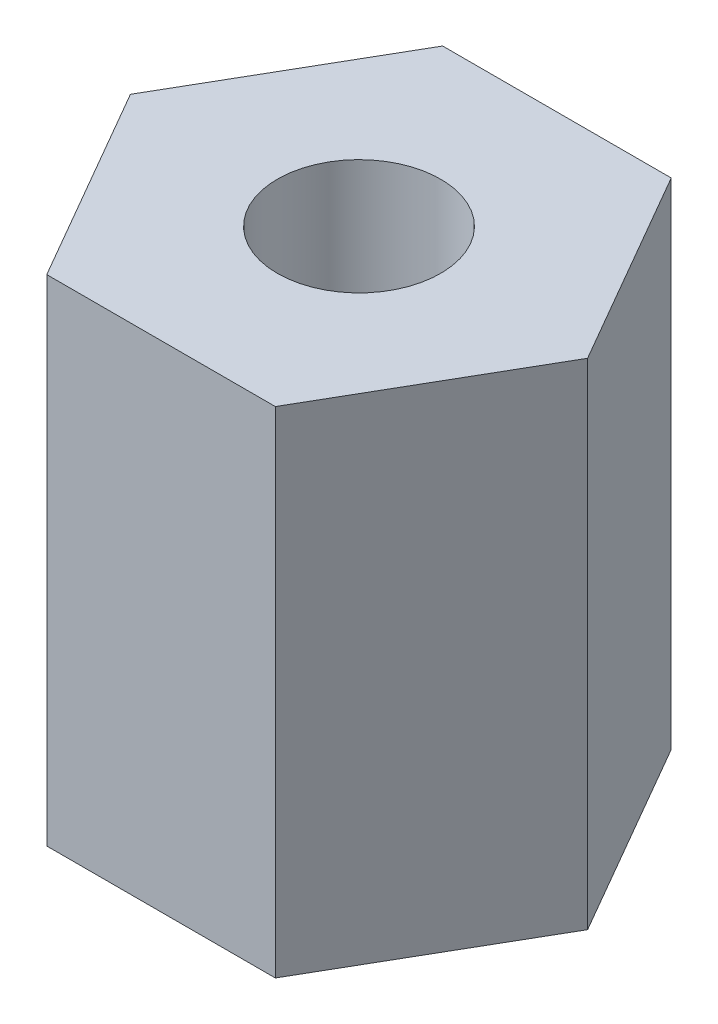
ISO-10303-21;
HEADER;
FILE_DESCRIPTION(('STEP AP214'),'2;1');
FILE_NAME('part.step','',(''),(''),'','','');
FILE_SCHEMA(('AUTOMOTIVE_DESIGN { 1 0 10303 214 1 1 1 1 }'));
ENDSEC;
DATA;
#1=APPLICATION_CONTEXT('core data for automotive mechanical design processes');
#2=APPLICATION_PROTOCOL_DEFINITION('international standard','automotive_design',2000,#1);
#3=PRODUCT_CONTEXT('',#1,'mechanical');
#4=PRODUCT('Part','Part','',(#3));
#5=PRODUCT_RELATED_PRODUCT_CATEGORY('part','',(#4));
#6=PRODUCT_DEFINITION_FORMATION('','',#4);
#7=PRODUCT_DEFINITION_CONTEXT('part definition',#1,'design');
#8=PRODUCT_DEFINITION('design','',#6,#7);
#9=PRODUCT_DEFINITION_SHAPE('','',#8);
#10=(LENGTH_UNIT() NAMED_UNIT(*) SI_UNIT(.MILLI.,.METRE.));
#11=(NAMED_UNIT(*) PLANE_ANGLE_UNIT() SI_UNIT($,.RADIAN.));
#12=(NAMED_UNIT(*) SI_UNIT($,.STERADIAN.) SOLID_ANGLE_UNIT());
#13=UNCERTAINTY_MEASURE_WITH_UNIT(LENGTH_MEASURE(1.E-05),#10,'distance_accuracy_value','');
#14=(GEOMETRIC_REPRESENTATION_CONTEXT(3) GLOBAL_UNCERTAINTY_ASSIGNED_CONTEXT((#13)) GLOBAL_UNIT_ASSIGNED_CONTEXT((#10,
#11,#12)) REPRESENTATION_CONTEXT('',''));
#15=CARTESIAN_POINT('',(0.,0.,0.));
#16=DIRECTION('',(0.,0.,1.));
#17=DIRECTION('',(1.,0.,0.));
#18=AXIS2_PLACEMENT_3D('',#15,#16,#17);
#19=CARTESIAN_POINT('',(4.61880215351701,10.,0.));
#20=DIRECTION('',(-0.866025403784438,0.,0.5));
#21=DIRECTION('',(0.5,0.,0.866025403784439));
#22=AXIS2_PLACEMENT_3D('',#19,#20,#21);
#23=PLANE('',#22);
#24=DIRECTION('',(-0.5,0.,-0.866025403784439));
#25=VECTOR('',#24,1.);
#26=CARTESIAN_POINT('',(4.61880215351701,0.,0.));
#27=LINE('',#26,#25);
#28=CARTESIAN_POINT('',(4.61880215351701,0.,0.));
#29=VERTEX_POINT('',#28);
#30=CARTESIAN_POINT('',(2.3094010767585,0.,-4.));
#31=VERTEX_POINT('',#30);
#32=EDGE_CURVE('E130',#29,#31,#27,.T.);
#33=ORIENTED_EDGE('',*,*,#32,.T.);
#34=DIRECTION('',(0.,-1.,0.));
#35=VECTOR('',#34,1.);
#36=CARTESIAN_POINT('',(2.3094010767585,10.,-4.));
#37=LINE('',#36,#35);
#38=CARTESIAN_POINT('',(2.3094010767585,10.,-4.));
#39=VERTEX_POINT('',#38);
#40=EDGE_CURVE('E11',#39,#31,#37,.T.);
#41=ORIENTED_EDGE('',*,*,#40,.F.);
#42=DIRECTION('',(-0.5,0.,-0.866025403784439));
#43=VECTOR('',#42,1.);
#44=CARTESIAN_POINT('',(4.61880215351701,10.,0.));
#45=LINE('',#44,#43);
#46=CARTESIAN_POINT('',(4.61880215351701,10.,0.));
#47=VERTEX_POINT('',#46);
#48=EDGE_CURVE('E146',#47,#39,#45,.T.);
#49=ORIENTED_EDGE('',*,*,#48,.F.);
#50=DIRECTION('',(0.,-1.,0.));
#51=VECTOR('',#50,1.);
#52=CARTESIAN_POINT('',(4.61880215351701,10.,0.));
#53=LINE('',#52,#51);
#54=EDGE_CURVE('E126',#47,#29,#53,.T.);
#55=ORIENTED_EDGE('',*,*,#54,.T.);
#56=EDGE_LOOP('',(#33,#41,#49,#55));
#57=FACE_BOUND('',#56,.T.);
#58=ADVANCED_FACE('F40',(#57),#23,.F.);
#59=CARTESIAN_POINT('',(2.3094010767585,10.,-4.));
#60=DIRECTION('',(0.,0.,1.));
#61=DIRECTION('',(1.,0.,0.));
#62=AXIS2_PLACEMENT_3D('',#59,#60,#61);
#63=PLANE('',#62);
#64=DIRECTION('',(-1.,0.,0.));
#65=VECTOR('',#64,1.);
#66=CARTESIAN_POINT('',(2.3094010767585,0.,-4.));
#67=LINE('',#66,#65);
#68=CARTESIAN_POINT('',(-2.3094010767585,0.,-4.));
#69=VERTEX_POINT('',#68);
#70=EDGE_CURVE('E134',#31,#69,#67,.T.);
#71=ORIENTED_EDGE('',*,*,#70,.T.);
#72=DIRECTION('',(0.,-1.,0.));
#73=VECTOR('',#72,1.);
#74=CARTESIAN_POINT('',(-2.3094010767585,10.,-4.));
#75=LINE('',#74,#73);
#76=CARTESIAN_POINT('',(-2.3094010767585,10.,-4.));
#77=VERTEX_POINT('',#76);
#78=EDGE_CURVE('E50',#77,#69,#75,.T.);
#79=ORIENTED_EDGE('',*,*,#78,.F.);
#80=DIRECTION('',(-1.,0.,0.));
#81=VECTOR('',#80,1.);
#82=CARTESIAN_POINT('',(2.3094010767585,10.,-4.));
#83=LINE('',#82,#81);
#84=EDGE_CURVE('E95',#39,#77,#83,.T.);
#85=ORIENTED_EDGE('',*,*,#84,.F.);
#86=ORIENTED_EDGE('',*,*,#40,.T.);
#87=EDGE_LOOP('',(#71,#79,#85,#86));
#88=FACE_BOUND('',#87,.T.);
#89=ADVANCED_FACE('F176',(#88),#63,.F.);
#90=CARTESIAN_POINT('',(-2.3094010767585,10.,-4.));
#91=DIRECTION('',(0.866025403784439,0.,0.5));
#92=DIRECTION('',(0.5,0.,-0.866025403784439));
#93=AXIS2_PLACEMENT_3D('',#90,#91,#92);
#94=PLANE('',#93);
#95=DIRECTION('',(-0.5,0.,0.866025403784439));
#96=VECTOR('',#95,1.);
#97=CARTESIAN_POINT('',(-2.3094010767585,0.,-4.));
#98=LINE('',#97,#96);
#99=CARTESIAN_POINT('',(-4.61880215351701,0.,0.));
#100=VERTEX_POINT('',#99);
#101=EDGE_CURVE('E137',#69,#100,#98,.T.);
#102=ORIENTED_EDGE('',*,*,#101,.T.);
#103=DIRECTION('',(0.,-1.,0.));
#104=VECTOR('',#103,1.);
#105=CARTESIAN_POINT('',(-4.61880215351701,10.,0.));
#106=LINE('',#105,#104);
#107=CARTESIAN_POINT('',(-4.61880215351701,10.,0.));
#108=VERTEX_POINT('',#107);
#109=EDGE_CURVE('E119',#108,#100,#106,.T.);
#110=ORIENTED_EDGE('',*,*,#109,.F.);
#111=DIRECTION('',(-0.5,0.,0.866025403784439));
#112=VECTOR('',#111,1.);
#113=CARTESIAN_POINT('',(-2.3094010767585,10.,-4.));
#114=LINE('',#113,#112);
#115=EDGE_CURVE('E108',#77,#108,#114,.T.);
#116=ORIENTED_EDGE('',*,*,#115,.F.);
#117=ORIENTED_EDGE('',*,*,#78,.T.);
#118=EDGE_LOOP('',(#102,#110,#116,#117));
#119=FACE_BOUND('',#118,.T.);
#120=ADVANCED_FACE('F157',(#119),#94,.F.);
#121=CARTESIAN_POINT('',(-4.61880215351701,10.,0.));
#122=DIRECTION('',(0.866025403784438,0.,-0.5));
#123=DIRECTION('',(-0.5,0.,-0.866025403784439));
#124=AXIS2_PLACEMENT_3D('',#121,#122,#123);
#125=PLANE('',#124);
#126=DIRECTION('',(0.5,0.,0.866025403784439));
#127=VECTOR('',#126,1.);
#128=CARTESIAN_POINT('',(-4.61880215351701,0.,0.));
#129=LINE('',#128,#127);
#130=CARTESIAN_POINT('',(-2.3094010767585,0.,4.));
#131=VERTEX_POINT('',#130);
#132=EDGE_CURVE('E117',#100,#131,#129,.T.);
#133=ORIENTED_EDGE('',*,*,#132,.T.);
#134=DIRECTION('',(0.,-1.,0.));
#135=VECTOR('',#134,1.);
#136=CARTESIAN_POINT('',(-2.3094010767585,10.,4.));
#137=LINE('',#136,#135);
#138=CARTESIAN_POINT('',(-2.3094010767585,10.,4.));
#139=VERTEX_POINT('',#138);
#140=EDGE_CURVE('E114',#139,#131,#137,.T.);
#141=ORIENTED_EDGE('',*,*,#140,.F.);
#142=DIRECTION('',(0.5,0.,0.866025403784439));
#143=VECTOR('',#142,1.);
#144=CARTESIAN_POINT('',(-4.61880215351701,10.,0.));
#145=LINE('',#144,#143);
#146=EDGE_CURVE('E102',#108,#139,#145,.T.);
#147=ORIENTED_EDGE('',*,*,#146,.F.);
#148=ORIENTED_EDGE('',*,*,#109,.T.);
#149=EDGE_LOOP('',(#133,#141,#147,#148));
#150=FACE_BOUND('',#149,.T.);
#151=ADVANCED_FACE('F115',(#150),#125,.F.);
#152=CARTESIAN_POINT('',(-2.3094010767585,10.,4.));
#153=DIRECTION('',(0.,0.,-1.));
#154=DIRECTION('',(-1.,0.,0.));
#155=AXIS2_PLACEMENT_3D('',#152,#153,#154);
#156=PLANE('',#155);
#157=DIRECTION('',(1.,0.,0.));
#158=VECTOR('',#157,1.);
#159=CARTESIAN_POINT('',(-2.3094010767585,0.,4.));
#160=LINE('',#159,#158);
#161=CARTESIAN_POINT('',(2.3094010767585,0.,4.));
#162=VERTEX_POINT('',#161);
#163=EDGE_CURVE('E81',#131,#162,#160,.T.);
#164=ORIENTED_EDGE('',*,*,#163,.T.);
#165=DIRECTION('',(0.,-1.,0.));
#166=VECTOR('',#165,1.);
#167=CARTESIAN_POINT('',(2.3094010767585,10.,4.));
#168=LINE('',#167,#166);
#169=CARTESIAN_POINT('',(2.3094010767585,10.,4.));
#170=VERTEX_POINT('',#169);
#171=EDGE_CURVE('E120',#170,#162,#168,.T.);
#172=ORIENTED_EDGE('',*,*,#171,.F.);
#173=DIRECTION('',(1.,0.,0.));
#174=VECTOR('',#173,1.);
#175=CARTESIAN_POINT('',(-2.3094010767585,10.,4.));
#176=LINE('',#175,#174);
#177=EDGE_CURVE('E106',#139,#170,#176,.T.);
#178=ORIENTED_EDGE('',*,*,#177,.F.);
#179=ORIENTED_EDGE('',*,*,#140,.T.);
#180=EDGE_LOOP('',(#164,#172,#178,#179));
#181=FACE_BOUND('',#180,.T.);
#182=ADVANCED_FACE('F122',(#181),#156,.F.);
#183=CARTESIAN_POINT('',(2.3094010767585,10.,4.));
#184=DIRECTION('',(-0.866025403784439,0.,-0.5));
#185=DIRECTION('',(-0.5,0.,0.866025403784439));
#186=AXIS2_PLACEMENT_3D('',#183,#184,#185);
#187=PLANE('',#186);
#188=DIRECTION('',(0.5,0.,-0.866025403784439));
#189=VECTOR('',#188,1.);
#190=CARTESIAN_POINT('',(2.3094010767585,0.,4.));
#191=LINE('',#190,#189);
#192=EDGE_CURVE('E87',#162,#29,#191,.T.);
#193=ORIENTED_EDGE('',*,*,#192,.T.);
#194=ORIENTED_EDGE('',*,*,#54,.F.);
#195=DIRECTION('',(0.5,0.,-0.866025403784439));
#196=VECTOR('',#195,1.);
#197=CARTESIAN_POINT('',(2.3094010767585,10.,4.));
#198=LINE('',#197,#196);
#199=EDGE_CURVE('E58',#170,#47,#198,.T.);
#200=ORIENTED_EDGE('',*,*,#199,.F.);
#201=ORIENTED_EDGE('',*,*,#171,.T.);
#202=EDGE_LOOP('',(#193,#194,#200,#201));
#203=FACE_BOUND('',#202,.T.);
#204=ADVANCED_FACE('F164',(#203),#187,.F.);
#205=CARTESIAN_POINT('',(0.,10.,0.));
#206=DIRECTION('',(0.,1.,0.));
#207=DIRECTION('',(0.,0.,1.));
#208=AXIS2_PLACEMENT_3D('',#205,#206,#207);
#209=PLANE('',#208);
#210=CARTESIAN_POINT('',(0.,10.,0.));
#211=DIRECTION('',(0.,1.,0.));
#212=DIRECTION('',(0.,0.,1.));
#213=AXIS2_PLACEMENT_3D('',#210,#211,#212);
#214=CIRCLE('',#213,1.64999999999999);
#215=CARTESIAN_POINT('',(0.,10.,1.64999999999999));
#216=VERTEX_POINT('',#215);
#217=EDGE_CURVE('E229',#216,#216,#214,.T.);
#218=ORIENTED_EDGE('',*,*,#217,.F.);
#219=EDGE_LOOP('',(#218));
#220=FACE_BOUND('',#219,.T.);
#221=ORIENTED_EDGE('',*,*,#48,.T.);
#222=ORIENTED_EDGE('',*,*,#84,.T.);
#223=ORIENTED_EDGE('',*,*,#115,.T.);
#224=ORIENTED_EDGE('',*,*,#146,.T.);
#225=ORIENTED_EDGE('',*,*,#177,.T.);
#226=ORIENTED_EDGE('',*,*,#199,.T.);
#227=EDGE_LOOP('',(#221,#222,#223,#224,#225,#226));
#228=FACE_BOUND('',#227,.T.);
#229=ADVANCED_FACE('F104',(#220,#228),#209,.T.);
#230=CARTESIAN_POINT('',(0.,0.,0.));
#231=DIRECTION('',(0.,1.,0.));
#232=DIRECTION('',(0.,0.,1.));
#233=AXIS2_PLACEMENT_3D('',#230,#231,#232);
#234=PLANE('',#233);
#235=CARTESIAN_POINT('',(0.,0.,0.));
#236=DIRECTION('',(0.,1.,0.));
#237=DIRECTION('',(0.,0.,1.));
#238=AXIS2_PLACEMENT_3D('',#235,#236,#237);
#239=CIRCLE('',#238,1.64999999999999);
#240=CARTESIAN_POINT('',(0.,0.,1.64999999999999));
#241=VERTEX_POINT('',#240);
#242=EDGE_CURVE('E43',#241,#241,#239,.T.);
#243=ORIENTED_EDGE('',*,*,#242,.T.);
#244=EDGE_LOOP('',(#243));
#245=FACE_BOUND('',#244,.T.);
#246=ORIENTED_EDGE('',*,*,#32,.F.);
#247=ORIENTED_EDGE('',*,*,#192,.F.);
#248=ORIENTED_EDGE('',*,*,#163,.F.);
#249=ORIENTED_EDGE('',*,*,#132,.F.);
#250=ORIENTED_EDGE('',*,*,#101,.F.);
#251=ORIENTED_EDGE('',*,*,#70,.F.);
#252=EDGE_LOOP('',(#246,#247,#248,#249,#250,#251));
#253=FACE_BOUND('',#252,.T.);
#254=ADVANCED_FACE('F160',(#245,#253),#234,.F.);
#255=CARTESIAN_POINT('',(0.,10.,0.));
#256=DIRECTION('',(0.,1.,0.));
#257=DIRECTION('',(0.,0.,1.));
#258=AXIS2_PLACEMENT_3D('',#255,#256,#257);
#259=CYLINDRICAL_SURFACE('',#258,1.64999999999999);
#260=ORIENTED_EDGE('',*,*,#217,.T.);
#261=EDGE_LOOP('',(#260));
#262=FACE_BOUND('',#261,.T.);
#263=ORIENTED_EDGE('',*,*,#242,.F.);
#264=EDGE_LOOP('',(#263));
#265=FACE_BOUND('',#264,.T.);
#266=ADVANCED_FACE('F213',(#262,#265),#259,.F.);
#267=CLOSED_SHELL('',(#58,#89,#120,#151,#182,#204,#229,#254,#266));
#268=MANIFOLD_SOLID_BREP('B2',#267);
#269=ADVANCED_BREP_SHAPE_REPRESENTATION('',(#18,#268),#14);
#270=SHAPE_DEFINITION_REPRESENTATION(#9,#269);
ENDSEC;
END-ISO-10303-21;
